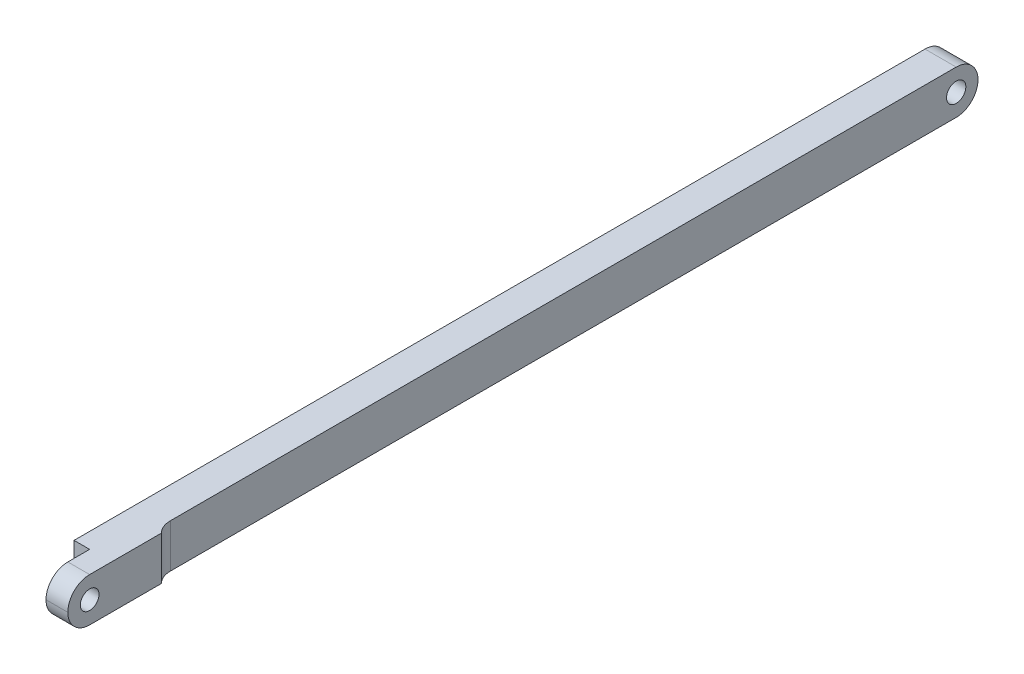
ISO-10303-21;
HEADER;
FILE_DESCRIPTION(('STEP AP214'),'2;1');
FILE_NAME('part.step','',(''),(''),'','','');
FILE_SCHEMA(('AUTOMOTIVE_DESIGN { 1 0 10303 214 1 1 1 1 }'));
ENDSEC;
DATA;
#1=APPLICATION_CONTEXT('core data for automotive mechanical design processes');
#2=APPLICATION_PROTOCOL_DEFINITION('international standard','automotive_design',2000,#1);
#3=PRODUCT_CONTEXT('',#1,'mechanical');
#4=PRODUCT('Part','Part','',(#3));
#5=PRODUCT_RELATED_PRODUCT_CATEGORY('part','',(#4));
#6=PRODUCT_DEFINITION_FORMATION('','',#4);
#7=PRODUCT_DEFINITION_CONTEXT('part definition',#1,'design');
#8=PRODUCT_DEFINITION('design','',#6,#7);
#9=PRODUCT_DEFINITION_SHAPE('','',#8);
#10=(LENGTH_UNIT() NAMED_UNIT(*) SI_UNIT(.MILLI.,.METRE.));
#11=(NAMED_UNIT(*) PLANE_ANGLE_UNIT() SI_UNIT($,.RADIAN.));
#12=(NAMED_UNIT(*) SI_UNIT($,.STERADIAN.) SOLID_ANGLE_UNIT());
#13=UNCERTAINTY_MEASURE_WITH_UNIT(LENGTH_MEASURE(1.E-05),#10,'distance_accuracy_value','');
#14=(GEOMETRIC_REPRESENTATION_CONTEXT(3) GLOBAL_UNCERTAINTY_ASSIGNED_CONTEXT((#13)) GLOBAL_UNIT_ASSIGNED_CONTEXT((#10,
#11,#12)) REPRESENTATION_CONTEXT('',''));
#15=CARTESIAN_POINT('',(0.,0.,0.));
#16=DIRECTION('',(0.,0.,1.));
#17=DIRECTION('',(1.,0.,0.));
#18=AXIS2_PLACEMENT_3D('',#15,#16,#17);
#19=CARTESIAN_POINT('',(2.5,3.5,140.));
#20=DIRECTION('',(-1.,0.,0.));
#21=DIRECTION('',(0.,-1.,0.));
#22=AXIS2_PLACEMENT_3D('',#19,#20,#21);
#23=PLANE('',#22);
#24=CARTESIAN_POINT('',(2.5,0.,3.5));
#25=DIRECTION('',(1.,0.,0.));
#26=DIRECTION('',(0.,1.,0.));
#27=AXIS2_PLACEMENT_3D('',#24,#25,#26);
#28=CIRCLE('',#27,1.55);
#29=CARTESIAN_POINT('',(2.5,1.55,3.5));
#30=VERTEX_POINT('',#29);
#31=EDGE_CURVE('E158',#30,#30,#28,.T.);
#32=ORIENTED_EDGE('',*,*,#31,.F.);
#33=EDGE_LOOP('',(#32));
#34=FACE_BOUND('',#33,.T.);
#35=DIRECTION('',(0.,0.,-1.));
#36=VECTOR('',#35,1.);
#37=CARTESIAN_POINT('',(2.5,3.5,140.));
#38=LINE('',#37,#36);
#39=CARTESIAN_POINT('',(2.5,3.5,129.550510257217));
#40=VERTEX_POINT('',#39);
#41=CARTESIAN_POINT('',(2.5,3.5,3.5));
#42=VERTEX_POINT('',#41);
#43=EDGE_CURVE('E209',#40,#42,#38,.T.);
#44=ORIENTED_EDGE('',*,*,#43,.F.);
#45=DIRECTION('',(0.,1.,0.));
#46=VECTOR('',#45,1.);
#47=CARTESIAN_POINT('',(2.5,3.5,129.550510257217));
#48=LINE('',#47,#46);
#49=CARTESIAN_POINT('',(2.5,-3.5,129.550510257217));
#50=VERTEX_POINT('',#49);
#51=EDGE_CURVE('E56',#40,#50,#48,.F.);
#52=ORIENTED_EDGE('',*,*,#51,.T.);
#53=DIRECTION('',(0.,0.,-1.));
#54=VECTOR('',#53,1.);
#55=CARTESIAN_POINT('',(2.5,-3.5,140.));
#56=LINE('',#55,#54);
#57=CARTESIAN_POINT('',(2.5,-3.5,3.5));
#58=VERTEX_POINT('',#57);
#59=EDGE_CURVE('E116',#50,#58,#56,.T.);
#60=ORIENTED_EDGE('',*,*,#59,.T.);
#61=CARTESIAN_POINT('',(2.5,0.,3.5));
#62=DIRECTION('',(-1.,0.,0.));
#63=DIRECTION('',(0.,-1.,0.));
#64=AXIS2_PLACEMENT_3D('',#61,#62,#63);
#65=CIRCLE('',#64,3.5);
#66=CARTESIAN_POINT('',(2.5,0.,0.));
#67=VERTEX_POINT('',#66);
#68=EDGE_CURVE('E216',#58,#67,#65,.F.);
#69=ORIENTED_EDGE('',*,*,#68,.T.);
#70=CARTESIAN_POINT('',(2.5,0.,3.5));
#71=DIRECTION('',(-1.,0.,0.));
#72=DIRECTION('',(0.,-1.,0.));
#73=AXIS2_PLACEMENT_3D('',#70,#71,#72);
#74=CIRCLE('',#73,3.5);
#75=EDGE_CURVE('E213',#67,#42,#74,.F.);
#76=ORIENTED_EDGE('',*,*,#75,.T.);
#77=EDGE_LOOP('',(#44,#52,#60,#69,#76));
#78=FACE_BOUND('',#77,.T.);
#79=ADVANCED_FACE('F35',(#34,#78),#23,.F.);
#80=CARTESIAN_POINT('',(-2.5,3.5,140.));
#81=DIRECTION('',(0.,-1.,0.));
#82=DIRECTION('',(0.,0.,-1.));
#83=AXIS2_PLACEMENT_3D('',#80,#81,#82);
#84=PLANE('',#83);
#85=DIRECTION('',(0.,0.,-1.));
#86=VECTOR('',#85,1.);
#87=CARTESIAN_POINT('',(0.,3.5,147.));
#88=LINE('',#87,#86);
#89=CARTESIAN_POINT('',(0.,3.5,143.5));
#90=VERTEX_POINT('',#89);
#91=CARTESIAN_POINT('',(0.,3.5,140.));
#92=VERTEX_POINT('',#91);
#93=EDGE_CURVE('E153',#90,#92,#88,.T.);
#94=ORIENTED_EDGE('',*,*,#93,.F.);
#95=DIRECTION('',(-1.,0.,0.));
#96=VECTOR('',#95,1.);
#97=CARTESIAN_POINT('',(3.5,3.5,143.5));
#98=LINE('',#97,#96);
#99=CARTESIAN_POINT('',(3.5,3.5,143.5));
#100=VERTEX_POINT('',#99);
#101=EDGE_CURVE('E162',#90,#100,#98,.F.);
#102=ORIENTED_EDGE('',*,*,#101,.T.);
#103=DIRECTION('',(0.,0.,1.));
#104=VECTOR('',#103,1.);
#105=CARTESIAN_POINT('',(3.5,3.5,147.));
#106=LINE('',#105,#104);
#107=CARTESIAN_POINT('',(3.5,3.5,132.));
#108=VERTEX_POINT('',#107);
#109=EDGE_CURVE('E128',#108,#100,#106,.T.);
#110=ORIENTED_EDGE('',*,*,#109,.F.);
#111=CARTESIAN_POINT('',(6.,3.5,129.550510257217));
#112=DIRECTION('',(0.,-1.,0.));
#113=DIRECTION('',(0.,0.,-1.));
#114=AXIS2_PLACEMENT_3D('',#111,#112,#113);
#115=CIRCLE('',#114,3.5);
#116=EDGE_CURVE('E43',#108,#40,#115,.T.);
#117=ORIENTED_EDGE('',*,*,#116,.T.);
#118=ORIENTED_EDGE('',*,*,#43,.T.);
#119=DIRECTION('',(-1.,0.,0.));
#120=VECTOR('',#119,1.);
#121=CARTESIAN_POINT('',(-2.5,3.5,3.5));
#122=LINE('',#121,#120);
#123=CARTESIAN_POINT('',(-2.5,3.5,3.5));
#124=VERTEX_POINT('',#123);
#125=EDGE_CURVE('E222',#42,#124,#122,.T.);
#126=ORIENTED_EDGE('',*,*,#125,.T.);
#127=DIRECTION('',(0.,0.,-1.));
#128=VECTOR('',#127,1.);
#129=CARTESIAN_POINT('',(-2.5,3.5,140.));
#130=LINE('',#129,#128);
#131=CARTESIAN_POINT('',(-2.5,3.5,140.));
#132=VERTEX_POINT('',#131);
#133=EDGE_CURVE('E206',#132,#124,#130,.T.);
#134=ORIENTED_EDGE('',*,*,#133,.F.);
#135=DIRECTION('',(-1.,0.,0.));
#136=VECTOR('',#135,1.);
#137=CARTESIAN_POINT('',(-2.5,3.5,140.));
#138=LINE('',#137,#136);
#139=EDGE_CURVE('E198',#92,#132,#138,.T.);
#140=ORIENTED_EDGE('',*,*,#139,.F.);
#141=EDGE_LOOP('',(#94,#102,#110,#117,#118,#126,#134,#140));
#142=FACE_BOUND('',#141,.T.);
#143=ADVANCED_FACE('F238',(#142),#84,.F.);
#144=CARTESIAN_POINT('',(-2.5,3.5,140.));
#145=DIRECTION('',(1.,0.,0.));
#146=DIRECTION('',(0.,1.,0.));
#147=AXIS2_PLACEMENT_3D('',#144,#145,#146);
#148=PLANE('',#147);
#149=CARTESIAN_POINT('',(-2.5,0.,3.5));
#150=DIRECTION('',(1.,0.,0.));
#151=DIRECTION('',(0.,1.,0.));
#152=AXIS2_PLACEMENT_3D('',#149,#150,#151);
#153=CIRCLE('',#152,1.55);
#154=CARTESIAN_POINT('',(-2.5,1.55,3.5));
#155=VERTEX_POINT('',#154);
#156=EDGE_CURVE('E136',#155,#155,#153,.T.);
#157=ORIENTED_EDGE('',*,*,#156,.T.);
#158=EDGE_LOOP('',(#157));
#159=FACE_BOUND('',#158,.T.);
#160=CARTESIAN_POINT('',(-2.5,0.,3.5));
#161=DIRECTION('',(1.,0.,0.));
#162=DIRECTION('',(0.,1.,0.));
#163=AXIS2_PLACEMENT_3D('',#160,#161,#162);
#164=CIRCLE('',#163,3.5);
#165=CARTESIAN_POINT('',(-2.5,0.,0.));
#166=VERTEX_POINT('',#165);
#167=EDGE_CURVE('E218',#124,#166,#164,.F.);
#168=ORIENTED_EDGE('',*,*,#167,.T.);
#169=CARTESIAN_POINT('',(-2.5,0.,3.5));
#170=DIRECTION('',(1.,0.,0.));
#171=DIRECTION('',(0.,1.,0.));
#172=AXIS2_PLACEMENT_3D('',#169,#170,#171);
#173=CIRCLE('',#172,3.5);
#174=CARTESIAN_POINT('',(-2.5,-3.5,3.5));
#175=VERTEX_POINT('',#174);
#176=EDGE_CURVE('E220',#166,#175,#173,.F.);
#177=ORIENTED_EDGE('',*,*,#176,.T.);
#178=DIRECTION('',(0.,0.,-1.));
#179=VECTOR('',#178,1.);
#180=CARTESIAN_POINT('',(-2.5,-3.5,140.));
#181=LINE('',#180,#179);
#182=CARTESIAN_POINT('',(-2.5,-3.5,140.));
#183=VERTEX_POINT('',#182);
#184=EDGE_CURVE('E196',#183,#175,#181,.T.);
#185=ORIENTED_EDGE('',*,*,#184,.F.);
#186=DIRECTION('',(0.,-1.,0.));
#187=VECTOR('',#186,1.);
#188=CARTESIAN_POINT('',(-2.5,3.5,140.));
#189=LINE('',#188,#187);
#190=EDGE_CURVE('E194',#132,#183,#189,.T.);
#191=ORIENTED_EDGE('',*,*,#190,.F.);
#192=ORIENTED_EDGE('',*,*,#133,.T.);
#193=EDGE_LOOP('',(#168,#177,#185,#191,#192));
#194=FACE_BOUND('',#193,.T.);
#195=ADVANCED_FACE('F247',(#159,#194),#148,.F.);
#196=CARTESIAN_POINT('',(-2.5,-3.5,140.));
#197=DIRECTION('',(0.,1.,0.));
#198=DIRECTION('',(0.,0.,1.));
#199=AXIS2_PLACEMENT_3D('',#196,#197,#198);
#200=PLANE('',#199);
#201=DIRECTION('',(0.,0.,-1.));
#202=VECTOR('',#201,1.);
#203=CARTESIAN_POINT('',(3.5,-3.5,147.));
#204=LINE('',#203,#202);
#205=CARTESIAN_POINT('',(3.5,-3.5,143.5));
#206=VERTEX_POINT('',#205);
#207=CARTESIAN_POINT('',(3.5,-3.5,132.));
#208=VERTEX_POINT('',#207);
#209=EDGE_CURVE('E113',#206,#208,#204,.T.);
#210=ORIENTED_EDGE('',*,*,#209,.F.);
#211=DIRECTION('',(1.,0.,0.));
#212=VECTOR('',#211,1.);
#213=CARTESIAN_POINT('',(0.,-3.5,143.5));
#214=LINE('',#213,#212);
#215=CARTESIAN_POINT('',(0.,-3.5,143.5));
#216=VERTEX_POINT('',#215);
#217=EDGE_CURVE('E154',#206,#216,#214,.F.);
#218=ORIENTED_EDGE('',*,*,#217,.T.);
#219=DIRECTION('',(0.,0.,-1.));
#220=VECTOR('',#219,1.);
#221=CARTESIAN_POINT('',(0.,-3.5,147.));
#222=LINE('',#221,#220);
#223=CARTESIAN_POINT('',(0.,-3.5,140.));
#224=VERTEX_POINT('',#223);
#225=EDGE_CURVE('E142',#216,#224,#222,.T.);
#226=ORIENTED_EDGE('',*,*,#225,.T.);
#227=DIRECTION('',(1.,0.,0.));
#228=VECTOR('',#227,1.);
#229=CARTESIAN_POINT('',(-2.5,-3.5,140.));
#230=LINE('',#229,#228);
#231=EDGE_CURVE('E143',#183,#224,#230,.T.);
#232=ORIENTED_EDGE('',*,*,#231,.F.);
#233=ORIENTED_EDGE('',*,*,#184,.T.);
#234=DIRECTION('',(1.,0.,0.));
#235=VECTOR('',#234,1.);
#236=CARTESIAN_POINT('',(-2.5,-3.5,3.5));
#237=LINE('',#236,#235);
#238=EDGE_CURVE('E211',#175,#58,#237,.T.);
#239=ORIENTED_EDGE('',*,*,#238,.T.);
#240=ORIENTED_EDGE('',*,*,#59,.F.);
#241=CARTESIAN_POINT('',(6.,-3.5,129.550510257217));
#242=DIRECTION('',(0.,1.,0.));
#243=DIRECTION('',(0.,0.,1.));
#244=AXIS2_PLACEMENT_3D('',#241,#242,#243);
#245=CIRCLE('',#244,3.5);
#246=EDGE_CURVE('E11',#50,#208,#245,.T.);
#247=ORIENTED_EDGE('',*,*,#246,.T.);
#248=EDGE_LOOP('',(#210,#218,#226,#232,#233,#239,#240,#247));
#249=FACE_BOUND('',#248,.T.);
#250=ADVANCED_FACE('F111',(#249),#200,.F.);
#251=CARTESIAN_POINT('',(0.,0.,140.));
#252=DIRECTION('',(0.,0.,1.));
#253=DIRECTION('',(1.,0.,0.));
#254=AXIS2_PLACEMENT_3D('',#251,#252,#253);
#255=PLANE('',#254);
#256=DIRECTION('',(0.,-1.,0.));
#257=VECTOR('',#256,1.);
#258=CARTESIAN_POINT('',(0.,3.5,140.));
#259=LINE('',#258,#257);
#260=EDGE_CURVE('E130',#92,#224,#259,.T.);
#261=ORIENTED_EDGE('',*,*,#260,.F.);
#262=ORIENTED_EDGE('',*,*,#139,.T.);
#263=ORIENTED_EDGE('',*,*,#190,.T.);
#264=ORIENTED_EDGE('',*,*,#231,.T.);
#265=EDGE_LOOP('',(#261,#262,#263,#264));
#266=FACE_BOUND('',#265,.T.);
#267=ADVANCED_FACE('F191',(#266),#255,.T.);
#268=CARTESIAN_POINT('',(-2.5,0.,3.5));
#269=DIRECTION('',(-1.,0.,0.));
#270=DIRECTION('',(0.,0.,1.));
#271=AXIS2_PLACEMENT_3D('',#268,#269,#270);
#272=CYLINDRICAL_SURFACE('',#271,3.5);
#273=DIRECTION('',(-1.,0.,0.));
#274=VECTOR('',#273,1.);
#275=CARTESIAN_POINT('',(0.,0.,0.));
#276=LINE('',#275,#274);
#277=EDGE_CURVE('E200',#166,#67,#276,.F.);
#278=ORIENTED_EDGE('',*,*,#277,.F.);
#279=ORIENTED_EDGE('',*,*,#167,.F.);
#280=ORIENTED_EDGE('',*,*,#125,.F.);
#281=ORIENTED_EDGE('',*,*,#75,.F.);
#282=EDGE_LOOP('',(#278,#279,#280,#281));
#283=FACE_BOUND('',#282,.T.);
#284=ADVANCED_FACE('F248',(#283),#272,.T.);
#285=CARTESIAN_POINT('',(-2.5,0.,3.5));
#286=DIRECTION('',(1.,0.,0.));
#287=DIRECTION('',(0.,0.,-1.));
#288=AXIS2_PLACEMENT_3D('',#285,#286,#287);
#289=CYLINDRICAL_SURFACE('',#288,3.5);
#290=ORIENTED_EDGE('',*,*,#176,.F.);
#291=ORIENTED_EDGE('',*,*,#277,.T.);
#292=ORIENTED_EDGE('',*,*,#68,.F.);
#293=ORIENTED_EDGE('',*,*,#238,.F.);
#294=EDGE_LOOP('',(#290,#291,#292,#293));
#295=FACE_BOUND('',#294,.T.);
#296=ADVANCED_FACE('F250',(#295),#289,.T.);
#297=CARTESIAN_POINT('',(-2.5,0.,3.5));
#298=DIRECTION('',(1.,0.,0.));
#299=DIRECTION('',(0.,1.,0.));
#300=AXIS2_PLACEMENT_3D('',#297,#298,#299);
#301=CYLINDRICAL_SURFACE('',#300,1.55);
#302=CARTESIAN_POINT('',(-2.5,1.55,3.5));
#303=CARTESIAN_POINT('',(-2.44791666666667,1.55,3.5));
#304=CARTESIAN_POINT('',(-2.39583333333333,1.55,3.5));
#305=CARTESIAN_POINT('',(-2.29166666666667,1.55,3.5));
#306=CARTESIAN_POINT('',(-2.23958333333333,1.55,3.5));
#307=CARTESIAN_POINT('',(-2.13541666666667,1.55,3.5));
#308=CARTESIAN_POINT('',(-2.08333333333333,1.55,3.5));
#309=CARTESIAN_POINT('',(-1.97916666666667,1.55,3.5));
#310=CARTESIAN_POINT('',(-1.92708333333333,1.55,3.5));
#311=CARTESIAN_POINT('',(-1.82291666666667,1.55,3.5));
#312=CARTESIAN_POINT('',(-1.77083333333333,1.55,3.5));
#313=CARTESIAN_POINT('',(-1.66666666666667,1.55,3.5));
#314=CARTESIAN_POINT('',(-1.61458333333333,1.55,3.5));
#315=CARTESIAN_POINT('',(-1.51041666666667,1.55,3.5));
#316=CARTESIAN_POINT('',(-1.45833333333333,1.55,3.5));
#317=CARTESIAN_POINT('',(-1.35416666666667,1.55,3.5));
#318=CARTESIAN_POINT('',(-1.30208333333333,1.55,3.5));
#319=CARTESIAN_POINT('',(-1.19791666666667,1.55,3.5));
#320=CARTESIAN_POINT('',(-1.14583333333333,1.55,3.5));
#321=CARTESIAN_POINT('',(-1.04166666666667,1.55,3.5));
#322=CARTESIAN_POINT('',(-0.989583333333334,1.55,3.5));
#323=CARTESIAN_POINT('',(-0.885416666666668,1.55,3.5));
#324=CARTESIAN_POINT('',(-0.833333333333334,1.55,3.5));
#325=CARTESIAN_POINT('',(-0.729166666666668,1.55,3.5));
#326=CARTESIAN_POINT('',(-0.677083333333334,1.55,3.5));
#327=CARTESIAN_POINT('',(-0.572916666666667,1.55,3.5));
#328=CARTESIAN_POINT('',(-0.520833333333334,1.55,3.5));
#329=CARTESIAN_POINT('',(-0.416666666666667,1.55,3.5));
#330=CARTESIAN_POINT('',(-0.364583333333334,1.55,3.5));
#331=CARTESIAN_POINT('',(-0.260416666666667,1.55,3.5));
#332=CARTESIAN_POINT('',(-0.208333333333334,1.55,3.5));
#333=CARTESIAN_POINT('',(-0.104166666666667,1.55,3.5));
#334=CARTESIAN_POINT('',(-0.0520833333333338,1.55,3.5));
#335=CARTESIAN_POINT('',(0.0520833333333329,1.55,3.5));
#336=CARTESIAN_POINT('',(0.104166666666666,1.55,3.5));
#337=CARTESIAN_POINT('',(0.208333333333333,1.55,3.5));
#338=CARTESIAN_POINT('',(0.260416666666666,1.55,3.5));
#339=CARTESIAN_POINT('',(0.364583333333333,1.55,3.5));
#340=CARTESIAN_POINT('',(0.416666666666667,1.55,3.5));
#341=CARTESIAN_POINT('',(0.520833333333333,1.55,3.5));
#342=CARTESIAN_POINT('',(0.572916666666667,1.55,3.5));
#343=CARTESIAN_POINT('',(0.677083333333333,1.55,3.5));
#344=CARTESIAN_POINT('',(0.729166666666667,1.55,3.5));
#345=CARTESIAN_POINT('',(0.833333333333333,1.55,3.5));
#346=CARTESIAN_POINT('',(0.885416666666667,1.55,3.5));
#347=CARTESIAN_POINT('',(0.989583333333333,1.55,3.5));
#348=CARTESIAN_POINT('',(1.04166666666667,1.55,3.5));
#349=CARTESIAN_POINT('',(1.14583333333333,1.55,3.5));
#350=CARTESIAN_POINT('',(1.19791666666667,1.55,3.5));
#351=CARTESIAN_POINT('',(1.30208333333333,1.55,3.5));
#352=CARTESIAN_POINT('',(1.35416666666667,1.55,3.5));
#353=CARTESIAN_POINT('',(1.45833333333333,1.55,3.5));
#354=CARTESIAN_POINT('',(1.51041666666667,1.55,3.5));
#355=CARTESIAN_POINT('',(1.61458333333333,1.55,3.5));
#356=CARTESIAN_POINT('',(1.66666666666667,1.55,3.5));
#357=CARTESIAN_POINT('',(1.77083333333333,1.55,3.5));
#358=CARTESIAN_POINT('',(1.82291666666667,1.55,3.5));
#359=CARTESIAN_POINT('',(1.92708333333333,1.55,3.5));
#360=CARTESIAN_POINT('',(1.97916666666667,1.55,3.5));
#361=CARTESIAN_POINT('',(2.08333333333333,1.55,3.5));
#362=CARTESIAN_POINT('',(2.13541666666667,1.55,3.5));
#363=CARTESIAN_POINT('',(2.23958333333333,1.55,3.5));
#364=CARTESIAN_POINT('',(2.29166666666667,1.55,3.5));
#365=CARTESIAN_POINT('',(2.39583333333333,1.55,3.5));
#366=CARTESIAN_POINT('',(2.44791666666667,1.55,3.5));
#367=CARTESIAN_POINT('',(2.5,1.55,3.5));
#368=B_SPLINE_CURVE_WITH_KNOTS('',3,(#302,#303,#304,#305,#306,#307,#308,#309,#310,#311,#312,
#313,#314,#315,#316,#317,#318,#319,#320,#321,#322,#323,#324,#325,#326,#327,#328,#329,#330,#331,
#332,#333,#334,#335,#336,#337,#338,#339,#340,#341,#342,#343,#344,#345,#346,#347,#348,#349,#350,
#351,#352,#353,#354,#355,#356,#357,#358,#359,#360,#361,#362,#363,#364,#365,#366,#367),
.UNSPECIFIED.,.F.,.F.,(4,2,2,2,2,2,2,2,2,2,2,2,2,2,2,2,2,2,2,2,2,2,2,2,2,2,2,2,2,2,2,2,4),(0.,
0.15625,0.3125,0.46875,0.625,0.78125,0.9375,1.09375,1.25,1.40625,1.5625,1.71875,1.875,2.03125,
2.1875,2.34375,2.5,2.65625,2.8125,2.96875,3.125,3.28125,3.4375,3.59375,3.75,3.90625,4.0625,
4.21875,4.375,4.53125,4.6875,4.84375,5.),.UNSPECIFIED.);
#369=EDGE_CURVE('BSEAM182',#155,#30,#368,.T.);
#370=ORIENTED_EDGE('',*,*,#156,.F.);
#371=ORIENTED_EDGE('',*,*,#31,.T.);
#372=ORIENTED_EDGE('',*,*,#369,.T.);
#373=ORIENTED_EDGE('',*,*,#369,.F.);
#374=EDGE_LOOP('',(#370,#372,#371,#373));
#375=FACE_BOUND('',#374,.T.);
#376=ADVANCED_FACE('F182',(#375),#301,.F.);
#377=CARTESIAN_POINT('',(0.,3.5,147.));
#378=DIRECTION('',(1.,0.,0.));
#379=DIRECTION('',(0.,1.,0.));
#380=AXIS2_PLACEMENT_3D('',#377,#378,#379);
#381=PLANE('',#380);
#382=CARTESIAN_POINT('',(0.,0.,143.5));
#383=DIRECTION('',(-1.,0.,0.));
#384=DIRECTION('',(0.,-1.,0.));
#385=AXIS2_PLACEMENT_3D('',#382,#383,#384);
#386=CIRCLE('',#385,1.5);
#387=CARTESIAN_POINT('',(0.,-1.5,143.5));
#388=VERTEX_POINT('',#387);
#389=EDGE_CURVE('E170',#388,#388,#386,.T.);
#390=ORIENTED_EDGE('',*,*,#389,.F.);
#391=EDGE_LOOP('',(#390));
#392=FACE_BOUND('',#391,.T.);
#393=ORIENTED_EDGE('',*,*,#225,.F.);
#394=CARTESIAN_POINT('',(0.,0.,143.5));
#395=DIRECTION('',(1.,0.,0.));
#396=DIRECTION('',(0.,1.,0.));
#397=AXIS2_PLACEMENT_3D('',#394,#395,#396);
#398=CIRCLE('',#397,3.5);
#399=CARTESIAN_POINT('',(0.,0.,147.));
#400=VERTEX_POINT('',#399);
#401=EDGE_CURVE('E160',#216,#400,#398,.F.);
#402=ORIENTED_EDGE('',*,*,#401,.T.);
#403=CARTESIAN_POINT('',(0.,0.,143.5));
#404=DIRECTION('',(1.,0.,0.));
#405=DIRECTION('',(0.,1.,0.));
#406=AXIS2_PLACEMENT_3D('',#403,#404,#405);
#407=CIRCLE('',#406,3.5);
#408=EDGE_CURVE('E156',#400,#90,#407,.F.);
#409=ORIENTED_EDGE('',*,*,#408,.T.);
#410=ORIENTED_EDGE('',*,*,#93,.T.);
#411=ORIENTED_EDGE('',*,*,#260,.T.);
#412=EDGE_LOOP('',(#393,#402,#409,#410,#411));
#413=FACE_BOUND('',#412,.T.);
#414=ADVANCED_FACE('F179',(#392,#413),#381,.F.);
#415=CARTESIAN_POINT('',(3.5,0.,0.));
#416=DIRECTION('',(1.,0.,0.));
#417=DIRECTION('',(0.,1.,0.));
#418=AXIS2_PLACEMENT_3D('',#415,#416,#417);
#419=PLANE('',#418);
#420=CARTESIAN_POINT('',(3.5,0.,143.5));
#421=DIRECTION('',(-1.,0.,0.));
#422=DIRECTION('',(0.,-1.,0.));
#423=AXIS2_PLACEMENT_3D('',#420,#421,#422);
#424=CIRCLE('',#423,1.5);
#425=CARTESIAN_POINT('',(3.5,-1.5,143.5));
#426=VERTEX_POINT('',#425);
#427=EDGE_CURVE('E166',#426,#426,#424,.T.);
#428=ORIENTED_EDGE('',*,*,#427,.T.);
#429=EDGE_LOOP('',(#428));
#430=FACE_BOUND('',#429,.T.);
#431=CARTESIAN_POINT('',(3.5,0.,143.5));
#432=DIRECTION('',(1.,0.,0.));
#433=DIRECTION('',(0.,1.,0.));
#434=AXIS2_PLACEMENT_3D('',#431,#432,#433);
#435=CIRCLE('',#434,3.5);
#436=CARTESIAN_POINT('',(3.5,0.,147.));
#437=VERTEX_POINT('',#436);
#438=EDGE_CURVE('E224',#100,#437,#435,.T.);
#439=ORIENTED_EDGE('',*,*,#438,.T.);
#440=CARTESIAN_POINT('',(3.5,0.,143.5));
#441=DIRECTION('',(1.,0.,0.));
#442=DIRECTION('',(0.,1.,0.));
#443=AXIS2_PLACEMENT_3D('',#440,#441,#442);
#444=CIRCLE('',#443,3.5);
#445=EDGE_CURVE('E125',#437,#206,#444,.T.);
#446=ORIENTED_EDGE('',*,*,#445,.T.);
#447=ORIENTED_EDGE('',*,*,#209,.T.);
#448=DIRECTION('',(0.,1.,0.));
#449=VECTOR('',#448,1.);
#450=CARTESIAN_POINT('',(3.5,3.5,132.));
#451=LINE('',#450,#449);
#452=EDGE_CURVE('E123',#208,#108,#451,.T.);
#453=ORIENTED_EDGE('',*,*,#452,.T.);
#454=ORIENTED_EDGE('',*,*,#109,.T.);
#455=EDGE_LOOP('',(#439,#446,#447,#453,#454));
#456=FACE_BOUND('',#455,.T.);
#457=ADVANCED_FACE('F121',(#430,#456),#419,.T.);
#458=CARTESIAN_POINT('',(0.,0.,143.5));
#459=DIRECTION('',(1.,0.,0.));
#460=DIRECTION('',(0.,0.,-1.));
#461=AXIS2_PLACEMENT_3D('',#458,#459,#460);
#462=CYLINDRICAL_SURFACE('',#461,3.5);
#463=ORIENTED_EDGE('',*,*,#101,.F.);
#464=ORIENTED_EDGE('',*,*,#408,.F.);
#465=DIRECTION('',(-1.,0.,0.));
#466=VECTOR('',#465,1.);
#467=CARTESIAN_POINT('',(0.,0.,147.));
#468=LINE('',#467,#466);
#469=EDGE_CURVE('E126',#437,#400,#468,.T.);
#470=ORIENTED_EDGE('',*,*,#469,.F.);
#471=ORIENTED_EDGE('',*,*,#438,.F.);
#472=EDGE_LOOP('',(#463,#464,#470,#471));
#473=FACE_BOUND('',#472,.T.);
#474=ADVANCED_FACE('F264',(#473),#462,.T.);
#475=CARTESIAN_POINT('',(0.,0.,143.5));
#476=DIRECTION('',(-1.,0.,0.));
#477=DIRECTION('',(0.,0.,1.));
#478=AXIS2_PLACEMENT_3D('',#475,#476,#477);
#479=CYLINDRICAL_SURFACE('',#478,3.5);
#480=ORIENTED_EDGE('',*,*,#401,.F.);
#481=ORIENTED_EDGE('',*,*,#217,.F.);
#482=ORIENTED_EDGE('',*,*,#445,.F.);
#483=ORIENTED_EDGE('',*,*,#469,.T.);
#484=EDGE_LOOP('',(#480,#481,#482,#483));
#485=FACE_BOUND('',#484,.T.);
#486=ADVANCED_FACE('F262',(#485),#479,.T.);
#487=CARTESIAN_POINT('',(3.5,0.,143.5));
#488=DIRECTION('',(-1.,0.,0.));
#489=DIRECTION('',(0.,-1.,0.));
#490=AXIS2_PLACEMENT_3D('',#487,#488,#489);
#491=CYLINDRICAL_SURFACE('',#490,1.5);
#492=ORIENTED_EDGE('',*,*,#427,.F.);
#493=EDGE_LOOP('',(#492));
#494=FACE_BOUND('',#493,.T.);
#495=ORIENTED_EDGE('',*,*,#389,.T.);
#496=EDGE_LOOP('',(#495));
#497=FACE_BOUND('',#496,.T.);
#498=ADVANCED_FACE('F177',(#494,#497),#491,.F.);
#499=CARTESIAN_POINT('',(6.,3.5,129.550510257217));
#500=DIRECTION('',(0.,1.,0.));
#501=DIRECTION('',(-1.,0.,0.));
#502=AXIS2_PLACEMENT_3D('',#499,#500,#501);
#503=CYLINDRICAL_SURFACE('',#502,3.5);
#504=ORIENTED_EDGE('',*,*,#246,.F.);
#505=ORIENTED_EDGE('',*,*,#51,.F.);
#506=ORIENTED_EDGE('',*,*,#116,.F.);
#507=ORIENTED_EDGE('',*,*,#452,.F.);
#508=EDGE_LOOP('',(#504,#505,#506,#507));
#509=FACE_BOUND('',#508,.T.);
#510=ADVANCED_FACE('F37',(#509),#503,.F.);
#511=CLOSED_SHELL('',(#79,#143,#195,#250,#267,#284,#296,#376,#414,#457,#474,#486,#498,#510));
#512=MANIFOLD_SOLID_BREP('B2',#511);
#513=ADVANCED_BREP_SHAPE_REPRESENTATION('',(#18,#512),#14);
#514=SHAPE_DEFINITION_REPRESENTATION(#9,#513);
ENDSEC;
END-ISO-10303-21;
